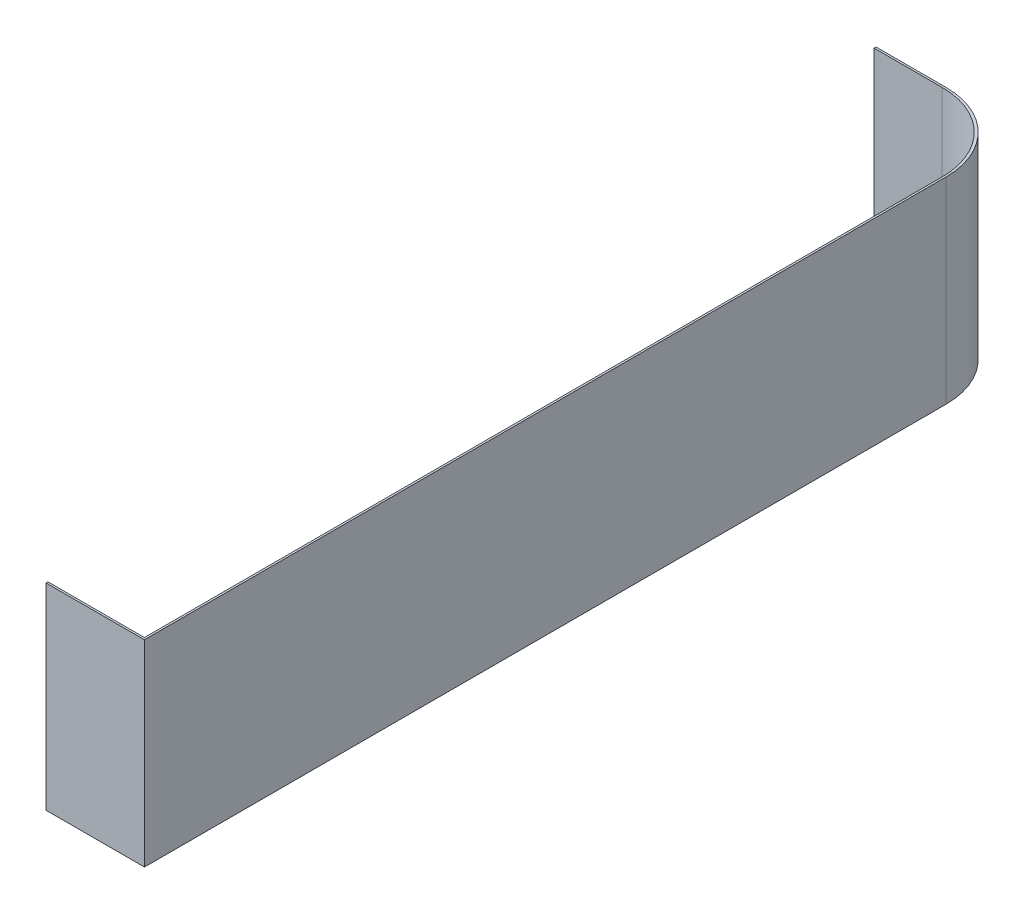
ISO-10303-21;
HEADER;
FILE_DESCRIPTION(('STEP AP214'),'2;1');
FILE_NAME('part.step','',(''),(''),'','','');
FILE_SCHEMA(('AUTOMOTIVE_DESIGN { 1 0 10303 214 1 1 1 1 }'));
ENDSEC;
DATA;
#1=APPLICATION_CONTEXT('core data for automotive mechanical design processes');
#2=APPLICATION_PROTOCOL_DEFINITION('international standard','automotive_design',2000,#1);
#3=PRODUCT_CONTEXT('',#1,'mechanical');
#4=PRODUCT('Part','Part','',(#3));
#5=PRODUCT_RELATED_PRODUCT_CATEGORY('part','',(#4));
#6=PRODUCT_DEFINITION_FORMATION('','',#4);
#7=PRODUCT_DEFINITION_CONTEXT('part definition',#1,'design');
#8=PRODUCT_DEFINITION('design','',#6,#7);
#9=PRODUCT_DEFINITION_SHAPE('','',#8);
#10=(LENGTH_UNIT() NAMED_UNIT(*) SI_UNIT(.MILLI.,.METRE.));
#11=(NAMED_UNIT(*) PLANE_ANGLE_UNIT() SI_UNIT($,.RADIAN.));
#12=(NAMED_UNIT(*) SI_UNIT($,.STERADIAN.) SOLID_ANGLE_UNIT());
#13=UNCERTAINTY_MEASURE_WITH_UNIT(LENGTH_MEASURE(1.E-05),#10,'distance_accuracy_value','');
#14=(GEOMETRIC_REPRESENTATION_CONTEXT(3) GLOBAL_UNCERTAINTY_ASSIGNED_CONTEXT((#13)) GLOBAL_UNIT_ASSIGNED_CONTEXT((#10,
#11,#12)) REPRESENTATION_CONTEXT('',''));
#15=CARTESIAN_POINT('',(0.,0.,0.));
#16=DIRECTION('',(0.,0.,1.));
#17=DIRECTION('',(1.,0.,0.));
#18=AXIS2_PLACEMENT_3D('',#15,#16,#17);
#19=CARTESIAN_POINT('',(38.0999000000016,50.8,0.));
#20=DIRECTION('',(0.,0.,1.));
#21=DIRECTION('',(1.,0.,0.));
#22=AXIS2_PLACEMENT_3D('',#19,#20,#21);
#23=PLANE('',#22);
#24=DIRECTION('',(-1.,0.,0.));
#25=VECTOR('',#24,1.);
#26=CARTESIAN_POINT('',(38.0999000000016,50.8,0.));
#27=LINE('',#26,#25);
#28=CARTESIAN_POINT('',(18.0999000000016,50.8,0.));
#29=VERTEX_POINT('',#28);
#30=CARTESIAN_POINT('',(0.,50.8,0.));
#31=VERTEX_POINT('',#30);
#32=EDGE_CURVE('E119',#29,#31,#27,.T.);
#33=ORIENTED_EDGE('',*,*,#32,.F.);
#34=DIRECTION('',(0.,-1.,0.));
#35=VECTOR('',#34,1.);
#36=CARTESIAN_POINT('',(18.0999000000016,50.8,0.));
#37=LINE('',#36,#35);
#38=CARTESIAN_POINT('',(18.0999000000016,0.,0.));
#39=VERTEX_POINT('',#38);
#40=EDGE_CURVE('E159',#29,#39,#37,.T.);
#41=ORIENTED_EDGE('',*,*,#40,.T.);
#42=DIRECTION('',(-1.,0.,0.));
#43=VECTOR('',#42,1.);
#44=CARTESIAN_POINT('',(38.0999000000016,0.,0.));
#45=LINE('',#44,#43);
#46=CARTESIAN_POINT('',(0.,0.,0.));
#47=VERTEX_POINT('',#46);
#48=EDGE_CURVE('E143',#39,#47,#45,.T.);
#49=ORIENTED_EDGE('',*,*,#48,.T.);
#50=DIRECTION('',(0.,-1.,0.));
#51=VECTOR('',#50,1.);
#52=CARTESIAN_POINT('',(0.,50.8,0.));
#53=LINE('',#52,#51);
#54=EDGE_CURVE('E136',#31,#47,#53,.T.);
#55=ORIENTED_EDGE('',*,*,#54,.F.);
#56=EDGE_LOOP('',(#33,#41,#49,#55));
#57=FACE_BOUND('',#56,.T.);
#58=ADVANCED_FACE('F42',(#57),#23,.F.);
#59=CARTESIAN_POINT('',(0.,50.8,0.));
#60=DIRECTION('',(1.,0.,0.));
#61=DIRECTION('',(0.,0.,-1.));
#62=AXIS2_PLACEMENT_3D('',#59,#60,#61);
#63=PLANE('',#62);
#64=DIRECTION('',(0.,0.,1.));
#65=VECTOR('',#64,1.);
#66=CARTESIAN_POINT('',(0.,0.,0.));
#67=LINE('',#66,#65);
#68=CARTESIAN_POINT('',(0.,0.,0.5));
#69=VERTEX_POINT('',#68);
#70=EDGE_CURVE('E195',#47,#69,#67,.T.);
#71=ORIENTED_EDGE('',*,*,#70,.T.);
#72=DIRECTION('',(0.,-1.,0.));
#73=VECTOR('',#72,1.);
#74=CARTESIAN_POINT('',(0.,50.8,0.5));
#75=LINE('',#74,#73);
#76=CARTESIAN_POINT('',(0.,50.8,0.5));
#77=VERTEX_POINT('',#76);
#78=EDGE_CURVE('E138',#77,#69,#75,.T.);
#79=ORIENTED_EDGE('',*,*,#78,.F.);
#80=DIRECTION('',(0.,0.,1.));
#81=VECTOR('',#80,1.);
#82=CARTESIAN_POINT('',(0.,50.8,0.));
#83=LINE('',#82,#81);
#84=EDGE_CURVE('E123',#31,#77,#83,.T.);
#85=ORIENTED_EDGE('',*,*,#84,.F.);
#86=ORIENTED_EDGE('',*,*,#54,.T.);
#87=EDGE_LOOP('',(#71,#79,#85,#86));
#88=FACE_BOUND('',#87,.T.);
#89=ADVANCED_FACE('F135',(#88),#63,.F.);
#90=CARTESIAN_POINT('',(0.,50.8,0.5));
#91=DIRECTION('',(0.,0.,-1.));
#92=DIRECTION('',(-1.,0.,0.));
#93=AXIS2_PLACEMENT_3D('',#90,#91,#92);
#94=PLANE('',#93);
#95=DIRECTION('',(1.,0.,0.));
#96=VECTOR('',#95,1.);
#97=CARTESIAN_POINT('',(0.,0.,0.5));
#98=LINE('',#97,#96);
#99=CARTESIAN_POINT('',(17.5999000000016,0.,0.5));
#100=VERTEX_POINT('',#99);
#101=EDGE_CURVE('E189',#69,#100,#98,.T.);
#102=ORIENTED_EDGE('',*,*,#101,.T.);
#103=DIRECTION('',(0.,-1.,0.));
#104=VECTOR('',#103,1.);
#105=CARTESIAN_POINT('',(17.5999000000016,50.8,0.5));
#106=LINE('',#105,#104);
#107=CARTESIAN_POINT('',(17.5999000000016,50.8,0.5));
#108=VERTEX_POINT('',#107);
#109=EDGE_CURVE('E151',#100,#108,#106,.F.);
#110=ORIENTED_EDGE('',*,*,#109,.T.);
#111=DIRECTION('',(1.,0.,0.));
#112=VECTOR('',#111,1.);
#113=CARTESIAN_POINT('',(0.,50.8,0.5));
#114=LINE('',#113,#112);
#115=EDGE_CURVE('E141',#77,#108,#114,.T.);
#116=ORIENTED_EDGE('',*,*,#115,.F.);
#117=ORIENTED_EDGE('',*,*,#78,.T.);
#118=EDGE_LOOP('',(#102,#110,#116,#117));
#119=FACE_BOUND('',#118,.T.);
#120=ADVANCED_FACE('F193',(#119),#94,.F.);
#121=CARTESIAN_POINT('',(37.5999000000016,50.8,0.5));
#122=DIRECTION('',(1.,0.,0.));
#123=DIRECTION('',(0.,0.,-1.));
#124=AXIS2_PLACEMENT_3D('',#121,#122,#123);
#125=PLANE('',#124);
#126=DIRECTION('',(0.,0.,1.));
#127=VECTOR('',#126,1.);
#128=CARTESIAN_POINT('',(37.5999000000016,50.8,0.5));
#129=LINE('',#128,#127);
#130=CARTESIAN_POINT('',(37.5999000000016,50.8,20.5));
#131=VERTEX_POINT('',#130);
#132=CARTESIAN_POINT('',(37.5999000000017,50.8,226.3634));
#133=VERTEX_POINT('',#132);
#134=EDGE_CURVE('E172',#131,#133,#129,.T.);
#135=ORIENTED_EDGE('',*,*,#134,.F.);
#136=DIRECTION('',(0.,-1.,0.));
#137=VECTOR('',#136,1.);
#138=CARTESIAN_POINT('',(37.5999000000016,0.,20.5));
#139=LINE('',#138,#137);
#140=CARTESIAN_POINT('',(37.5999000000016,0.,20.5));
#141=VERTEX_POINT('',#140);
#142=EDGE_CURVE('E146',#131,#141,#139,.T.);
#143=ORIENTED_EDGE('',*,*,#142,.T.);
#144=DIRECTION('',(0.,0.,1.));
#145=VECTOR('',#144,1.);
#146=CARTESIAN_POINT('',(37.5999000000016,0.,0.5));
#147=LINE('',#146,#145);
#148=CARTESIAN_POINT('',(37.5999000000017,0.,226.3634));
#149=VERTEX_POINT('',#148);
#150=EDGE_CURVE('E191',#141,#149,#147,.T.);
#151=ORIENTED_EDGE('',*,*,#150,.T.);
#152=DIRECTION('',(0.,-1.,0.));
#153=VECTOR('',#152,1.);
#154=CARTESIAN_POINT('',(37.5999000000017,50.8,226.3634));
#155=LINE('',#154,#153);
#156=EDGE_CURVE('E153',#133,#149,#155,.T.);
#157=ORIENTED_EDGE('',*,*,#156,.F.);
#158=EDGE_LOOP('',(#135,#143,#151,#157));
#159=FACE_BOUND('',#158,.T.);
#160=ADVANCED_FACE('F178',(#159),#125,.F.);
#161=CARTESIAN_POINT('',(37.5999000000017,50.8,226.3634));
#162=DIRECTION('',(0.,0.,1.));
#163=DIRECTION('',(1.,0.,0.));
#164=AXIS2_PLACEMENT_3D('',#161,#162,#163);
#165=PLANE('',#164);
#166=DIRECTION('',(-1.,0.,0.));
#167=VECTOR('',#166,1.);
#168=CARTESIAN_POINT('',(37.5999000000017,0.,226.3634));
#169=LINE('',#168,#167);
#170=CARTESIAN_POINT('',(12.6999,0.,226.3634));
#171=VERTEX_POINT('',#170);
#172=EDGE_CURVE('E199',#149,#171,#169,.T.);
#173=ORIENTED_EDGE('',*,*,#172,.T.);
#174=DIRECTION('',(0.,-1.,0.));
#175=VECTOR('',#174,1.);
#176=CARTESIAN_POINT('',(12.6999,50.8,226.3634));
#177=LINE('',#176,#175);
#178=CARTESIAN_POINT('',(12.6999,50.8,226.3634));
#179=VERTEX_POINT('',#178);
#180=EDGE_CURVE('E223',#179,#171,#177,.T.);
#181=ORIENTED_EDGE('',*,*,#180,.F.);
#182=DIRECTION('',(-1.,0.,0.));
#183=VECTOR('',#182,1.);
#184=CARTESIAN_POINT('',(37.5999000000017,50.8,226.3634));
#185=LINE('',#184,#183);
#186=EDGE_CURVE('E183',#133,#179,#185,.T.);
#187=ORIENTED_EDGE('',*,*,#186,.F.);
#188=ORIENTED_EDGE('',*,*,#156,.T.);
#189=EDGE_LOOP('',(#173,#181,#187,#188));
#190=FACE_BOUND('',#189,.T.);
#191=ADVANCED_FACE('F228',(#190),#165,.F.);
#192=CARTESIAN_POINT('',(12.6999,50.8,226.3634));
#193=DIRECTION('',(1.,0.,0.));
#194=DIRECTION('',(0.,0.,-1.));
#195=AXIS2_PLACEMENT_3D('',#192,#193,#194);
#196=PLANE('',#195);
#197=DIRECTION('',(0.,0.,1.));
#198=VECTOR('',#197,1.);
#199=CARTESIAN_POINT('',(12.6999,0.,226.3634));
#200=LINE('',#199,#198);
#201=CARTESIAN_POINT('',(12.6999,0.,226.8634));
#202=VERTEX_POINT('',#201);
#203=EDGE_CURVE('E206',#171,#202,#200,.T.);
#204=ORIENTED_EDGE('',*,*,#203,.T.);
#205=DIRECTION('',(0.,-1.,0.));
#206=VECTOR('',#205,1.);
#207=CARTESIAN_POINT('',(12.6999,50.8,226.8634));
#208=LINE('',#207,#206);
#209=CARTESIAN_POINT('',(12.6999,50.8,226.8634));
#210=VERTEX_POINT('',#209);
#211=EDGE_CURVE('E218',#210,#202,#208,.T.);
#212=ORIENTED_EDGE('',*,*,#211,.F.);
#213=DIRECTION('',(0.,0.,1.));
#214=VECTOR('',#213,1.);
#215=CARTESIAN_POINT('',(12.6999,50.8,226.3634));
#216=LINE('',#215,#214);
#217=EDGE_CURVE('E242',#179,#210,#216,.T.);
#218=ORIENTED_EDGE('',*,*,#217,.F.);
#219=ORIENTED_EDGE('',*,*,#180,.T.);
#220=EDGE_LOOP('',(#204,#212,#218,#219));
#221=FACE_BOUND('',#220,.T.);
#222=ADVANCED_FACE('F234',(#221),#196,.F.);
#223=CARTESIAN_POINT('',(12.6999,50.8,226.8634));
#224=DIRECTION('',(0.,0.,-1.));
#225=DIRECTION('',(-1.,0.,0.));
#226=AXIS2_PLACEMENT_3D('',#223,#224,#225);
#227=PLANE('',#226);
#228=DIRECTION('',(1.,0.,0.));
#229=VECTOR('',#228,1.);
#230=CARTESIAN_POINT('',(12.6999,0.,226.8634));
#231=LINE('',#230,#229);
#232=CARTESIAN_POINT('',(38.0999000000017,0.,226.8634));
#233=VERTEX_POINT('',#232);
#234=EDGE_CURVE('E209',#202,#233,#231,.T.);
#235=ORIENTED_EDGE('',*,*,#234,.T.);
#236=DIRECTION('',(0.,-1.,0.));
#237=VECTOR('',#236,1.);
#238=CARTESIAN_POINT('',(38.0999000000017,50.8,226.8634));
#239=LINE('',#238,#237);
#240=CARTESIAN_POINT('',(38.0999000000017,50.8,226.8634));
#241=VERTEX_POINT('',#240);
#242=EDGE_CURVE('E214',#241,#233,#239,.T.);
#243=ORIENTED_EDGE('',*,*,#242,.F.);
#244=DIRECTION('',(1.,0.,0.));
#245=VECTOR('',#244,1.);
#246=CARTESIAN_POINT('',(12.6999,50.8,226.8634));
#247=LINE('',#246,#245);
#248=EDGE_CURVE('E240',#210,#241,#247,.T.);
#249=ORIENTED_EDGE('',*,*,#248,.F.);
#250=ORIENTED_EDGE('',*,*,#211,.T.);
#251=EDGE_LOOP('',(#235,#243,#249,#250));
#252=FACE_BOUND('',#251,.T.);
#253=ADVANCED_FACE('F238',(#252),#227,.F.);
#254=CARTESIAN_POINT('',(38.0999000000017,50.8,226.8634));
#255=DIRECTION('',(-1.,0.,0.));
#256=DIRECTION('',(0.,0.,1.));
#257=AXIS2_PLACEMENT_3D('',#254,#255,#256);
#258=PLANE('',#257);
#259=DIRECTION('',(0.,0.,-1.));
#260=VECTOR('',#259,1.);
#261=CARTESIAN_POINT('',(38.0999000000017,0.,226.8634));
#262=LINE('',#261,#260);
#263=CARTESIAN_POINT('',(38.0999000000016,0.,20.));
#264=VERTEX_POINT('',#263);
#265=EDGE_CURVE('E131',#233,#264,#262,.T.);
#266=ORIENTED_EDGE('',*,*,#265,.T.);
#267=DIRECTION('',(0.,-1.,0.));
#268=VECTOR('',#267,1.);
#269=CARTESIAN_POINT('',(38.0999000000016,50.8,20.));
#270=LINE('',#269,#268);
#271=CARTESIAN_POINT('',(38.0999000000016,50.8,20.));
#272=VERTEX_POINT('',#271);
#273=EDGE_CURVE('E58',#264,#272,#270,.F.);
#274=ORIENTED_EDGE('',*,*,#273,.T.);
#275=DIRECTION('',(0.,0.,-1.));
#276=VECTOR('',#275,1.);
#277=CARTESIAN_POINT('',(38.0999000000017,50.8,226.8634));
#278=LINE('',#277,#276);
#279=EDGE_CURVE('E219',#241,#272,#278,.T.);
#280=ORIENTED_EDGE('',*,*,#279,.F.);
#281=ORIENTED_EDGE('',*,*,#242,.T.);
#282=EDGE_LOOP('',(#266,#274,#280,#281));
#283=FACE_BOUND('',#282,.T.);
#284=ADVANCED_FACE('F276',(#283),#258,.F.);
#285=CARTESIAN_POINT('',(0.,50.8,0.));
#286=DIRECTION('',(0.,1.,0.));
#287=DIRECTION('',(0.,0.,1.));
#288=AXIS2_PLACEMENT_3D('',#285,#286,#287);
#289=PLANE('',#288);
#290=ORIENTED_EDGE('',*,*,#279,.T.);
#291=CARTESIAN_POINT('',(18.0999000000016,50.8,20.));
#292=DIRECTION('',(0.,1.,0.));
#293=DIRECTION('',(0.,0.,1.));
#294=AXIS2_PLACEMENT_3D('',#291,#292,#293);
#295=CIRCLE('',#294,20.);
#296=EDGE_CURVE('E11',#272,#29,#295,.T.);
#297=ORIENTED_EDGE('',*,*,#296,.T.);
#298=ORIENTED_EDGE('',*,*,#32,.T.);
#299=ORIENTED_EDGE('',*,*,#84,.T.);
#300=ORIENTED_EDGE('',*,*,#115,.T.);
#301=CARTESIAN_POINT('',(17.5999000000016,50.8,20.5));
#302=DIRECTION('',(0.,1.,0.));
#303=DIRECTION('',(0.,0.,1.));
#304=AXIS2_PLACEMENT_3D('',#301,#302,#303);
#305=CIRCLE('',#304,20.);
#306=EDGE_CURVE('E167',#108,#131,#305,.F.);
#307=ORIENTED_EDGE('',*,*,#306,.T.);
#308=ORIENTED_EDGE('',*,*,#134,.T.);
#309=ORIENTED_EDGE('',*,*,#186,.T.);
#310=ORIENTED_EDGE('',*,*,#217,.T.);
#311=ORIENTED_EDGE('',*,*,#248,.T.);
#312=EDGE_LOOP('',(#290,#297,#298,#299,#300,#307,#308,#309,#310,#311));
#313=FACE_BOUND('',#312,.T.);
#314=ADVANCED_FACE('F121',(#313),#289,.T.);
#315=CARTESIAN_POINT('',(0.,0.,0.));
#316=DIRECTION('',(0.,1.,0.));
#317=DIRECTION('',(0.,0.,1.));
#318=AXIS2_PLACEMENT_3D('',#315,#316,#317);
#319=PLANE('',#318);
#320=ORIENTED_EDGE('',*,*,#48,.F.);
#321=CARTESIAN_POINT('',(18.0999000000016,0.,20.));
#322=DIRECTION('',(0.,1.,0.));
#323=DIRECTION('',(0.,0.,1.));
#324=AXIS2_PLACEMENT_3D('',#321,#322,#323);
#325=CIRCLE('',#324,20.);
#326=EDGE_CURVE('E51',#39,#264,#325,.F.);
#327=ORIENTED_EDGE('',*,*,#326,.T.);
#328=ORIENTED_EDGE('',*,*,#265,.F.);
#329=ORIENTED_EDGE('',*,*,#234,.F.);
#330=ORIENTED_EDGE('',*,*,#203,.F.);
#331=ORIENTED_EDGE('',*,*,#172,.F.);
#332=ORIENTED_EDGE('',*,*,#150,.F.);
#333=CARTESIAN_POINT('',(17.5999000000016,0.,20.5));
#334=DIRECTION('',(0.,1.,0.));
#335=DIRECTION('',(0.,0.,1.));
#336=AXIS2_PLACEMENT_3D('',#333,#334,#335);
#337=CIRCLE('',#336,20.);
#338=EDGE_CURVE('E164',#141,#100,#337,.T.);
#339=ORIENTED_EDGE('',*,*,#338,.T.);
#340=ORIENTED_EDGE('',*,*,#101,.F.);
#341=ORIENTED_EDGE('',*,*,#70,.F.);
#342=EDGE_LOOP('',(#320,#327,#328,#329,#330,#331,#332,#339,#340,#341));
#343=FACE_BOUND('',#342,.T.);
#344=ADVANCED_FACE('F188',(#343),#319,.F.);
#345=CARTESIAN_POINT('',(17.5999000000016,50.8,20.5));
#346=DIRECTION('',(0.,1.,0.));
#347=DIRECTION('',(0.,0.,1.));
#348=AXIS2_PLACEMENT_3D('',#345,#346,#347);
#349=CYLINDRICAL_SURFACE('',#348,20.);
#350=ORIENTED_EDGE('',*,*,#306,.F.);
#351=ORIENTED_EDGE('',*,*,#109,.F.);
#352=ORIENTED_EDGE('',*,*,#338,.F.);
#353=ORIENTED_EDGE('',*,*,#142,.F.);
#354=EDGE_LOOP('',(#350,#351,#352,#353));
#355=FACE_BOUND('',#354,.T.);
#356=ADVANCED_FACE('F185',(#355),#349,.F.);
#357=CARTESIAN_POINT('',(18.0999000000016,50.8,20.));
#358=DIRECTION('',(0.,-1.,0.));
#359=DIRECTION('',(0.,0.,-1.));
#360=AXIS2_PLACEMENT_3D('',#357,#358,#359);
#361=CYLINDRICAL_SURFACE('',#360,20.);
#362=ORIENTED_EDGE('',*,*,#296,.F.);
#363=ORIENTED_EDGE('',*,*,#273,.F.);
#364=ORIENTED_EDGE('',*,*,#326,.F.);
#365=ORIENTED_EDGE('',*,*,#40,.F.);
#366=EDGE_LOOP('',(#362,#363,#364,#365));
#367=FACE_BOUND('',#366,.T.);
#368=ADVANCED_FACE('F44',(#367),#361,.T.);
#369=CLOSED_SHELL('',(#58,#89,#120,#160,#191,#222,#253,#284,#314,#344,#356,#368));
#370=MANIFOLD_SOLID_BREP('B2',#369);
#371=ADVANCED_BREP_SHAPE_REPRESENTATION('',(#18,#370),#14);
#372=SHAPE_DEFINITION_REPRESENTATION(#9,#371);
ENDSEC;
END-ISO-10303-21;
